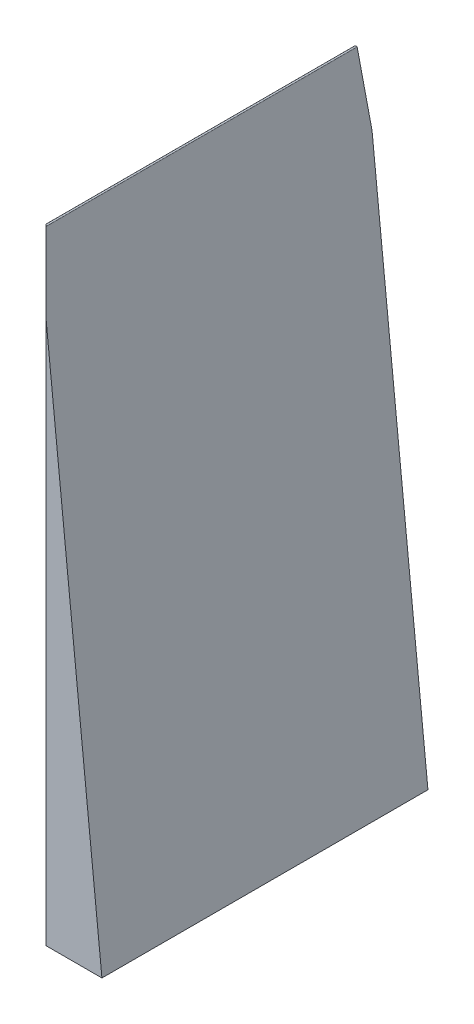
ISO-10303-21;
HEADER;
FILE_DESCRIPTION(('STEP AP214'),'2;1');
FILE_NAME('part.step','',(''),(''),'','','');
FILE_SCHEMA(('AUTOMOTIVE_DESIGN { 1 0 10303 214 1 1 1 1 }'));
ENDSEC;
DATA;
#1=APPLICATION_CONTEXT('core data for automotive mechanical design processes');
#2=APPLICATION_PROTOCOL_DEFINITION('international standard','automotive_design',2000,#1);
#3=PRODUCT_CONTEXT('',#1,'mechanical');
#4=PRODUCT('Part','Part','',(#3));
#5=PRODUCT_RELATED_PRODUCT_CATEGORY('part','',(#4));
#6=PRODUCT_DEFINITION_FORMATION('','',#4);
#7=PRODUCT_DEFINITION_CONTEXT('part definition',#1,'design');
#8=PRODUCT_DEFINITION('design','',#6,#7);
#9=PRODUCT_DEFINITION_SHAPE('','',#8);
#10=(LENGTH_UNIT() NAMED_UNIT(*) SI_UNIT(.MILLI.,.METRE.));
#11=(NAMED_UNIT(*) PLANE_ANGLE_UNIT() SI_UNIT($,.RADIAN.));
#12=(NAMED_UNIT(*) SI_UNIT($,.STERADIAN.) SOLID_ANGLE_UNIT());
#13=UNCERTAINTY_MEASURE_WITH_UNIT(LENGTH_MEASURE(1.E-05),#10,'distance_accuracy_value','');
#14=(GEOMETRIC_REPRESENTATION_CONTEXT(3) GLOBAL_UNCERTAINTY_ASSIGNED_CONTEXT((#13)) GLOBAL_UNIT_ASSIGNED_CONTEXT((#10,
#11,#12)) REPRESENTATION_CONTEXT('',''));
#15=CARTESIAN_POINT('',(0.,0.,0.));
#16=DIRECTION('',(0.,0.,1.));
#17=DIRECTION('',(1.,0.,0.));
#18=AXIS2_PLACEMENT_3D('',#15,#16,#17);
#19=CARTESIAN_POINT('',(8.89,0.,44.45));
#20=DIRECTION('',(0.,1.,0.));
#21=DIRECTION('',(0.,0.,1.));
#22=AXIS2_PLACEMENT_3D('',#19,#20,#21);
#23=PLANE('',#22);
#24=DIRECTION('',(1.,0.,0.));
#25=VECTOR('',#24,1.);
#26=CARTESIAN_POINT('',(8.89,0.,44.45));
#27=LINE('',#26,#25);
#28=CARTESIAN_POINT('',(1.26999999999999,0.,44.45));
#29=VERTEX_POINT('',#28);
#30=CARTESIAN_POINT('',(8.89,0.,44.45));
#31=VERTEX_POINT('',#30);
#32=EDGE_CURVE('E98',#29,#31,#27,.T.);
#33=ORIENTED_EDGE('',*,*,#32,.F.);
#34=DIRECTION('',(0.,0.,-1.));
#35=VECTOR('',#34,1.);
#36=CARTESIAN_POINT('',(1.26999999999999,0.,44.45));
#37=LINE('',#36,#35);
#38=CARTESIAN_POINT('',(1.26999999999999,0.,0.));
#39=VERTEX_POINT('',#38);
#40=EDGE_CURVE('E55',#29,#39,#37,.T.);
#41=ORIENTED_EDGE('',*,*,#40,.T.);
#42=DIRECTION('',(1.,0.,0.));
#43=VECTOR('',#42,1.);
#44=CARTESIAN_POINT('',(8.89,0.,0.));
#45=LINE('',#44,#43);
#46=CARTESIAN_POINT('',(8.89,0.,0.));
#47=VERTEX_POINT('',#46);
#48=EDGE_CURVE('E114',#39,#47,#45,.T.);
#49=ORIENTED_EDGE('',*,*,#48,.T.);
#50=DIRECTION('',(0.,0.,-1.));
#51=VECTOR('',#50,1.);
#52=CARTESIAN_POINT('',(8.89,0.,44.45));
#53=LINE('',#52,#51);
#54=EDGE_CURVE('E110',#31,#47,#53,.T.);
#55=ORIENTED_EDGE('',*,*,#54,.F.);
#56=EDGE_LOOP('',(#33,#41,#49,#55));
#57=FACE_BOUND('',#56,.T.);
#58=ADVANCED_FACE('F44',(#57),#23,.F.);
#59=CARTESIAN_POINT('',(0.,86.36,44.45));
#60=DIRECTION('',(-0.994743298890183,-0.102400045473989,0.));
#61=DIRECTION('',(0.102400045473989,-0.994743298890184,0.));
#62=AXIS2_PLACEMENT_3D('',#59,#60,#61);
#63=PLANE('',#62);
#64=DIRECTION('',(-0.102400045473989,0.994743298890183,0.));
#65=VECTOR('',#64,1.);
#66=CARTESIAN_POINT('',(0.,86.36,0.));
#67=LINE('',#66,#65);
#68=CARTESIAN_POINT('',(1.26999999999999,74.0228571428572,0.));
#69=VERTEX_POINT('',#68);
#70=EDGE_CURVE('E105',#47,#69,#67,.T.);
#71=ORIENTED_EDGE('',*,*,#70,.T.);
#72=DIRECTION('',(-0.101867359422504,0.989568634390042,0.101867359422504));
#73=VECTOR('',#72,1.);
#74=CARTESIAN_POINT('',(8.70549767047861,1.79230834392207,-7.43549767047862));
#75=LINE('',#74,#73);
#76=CARTESIAN_POINT('',(0.253332398959054,83.8990566958263,1.01666760104094));
#77=VERTEX_POINT('',#76);
#78=EDGE_CURVE('E143',#69,#77,#75,.T.);
#79=ORIENTED_EDGE('',*,*,#78,.T.);
#80=DIRECTION('',(0.,0.,-1.));
#81=VECTOR('',#80,1.);
#82=CARTESIAN_POINT('',(0.253332398959054,83.8990566958263,44.45));
#83=LINE('',#82,#81);
#84=CARTESIAN_POINT('',(0.253332398959054,83.8990566958263,43.4333323989591));
#85=VERTEX_POINT('',#84);
#86=EDGE_CURVE('E121',#77,#85,#83,.F.);
#87=ORIENTED_EDGE('',*,*,#86,.T.);
#88=DIRECTION('',(-0.101867359422504,0.989568634390042,-0.101867359422504));
#89=VECTOR('',#88,1.);
#90=CARTESIAN_POINT('',(8.73185514612452,1.53626429479034,51.9118551461245));
#91=LINE('',#90,#89);
#92=CARTESIAN_POINT('',(1.26999999999999,74.0228571428572,44.45));
#93=VERTEX_POINT('',#92);
#94=EDGE_CURVE('E69',#85,#93,#91,.F.);
#95=ORIENTED_EDGE('',*,*,#94,.T.);
#96=DIRECTION('',(-0.102400045473989,0.994743298890183,0.));
#97=VECTOR('',#96,1.);
#98=CARTESIAN_POINT('',(0.,86.36,44.45));
#99=LINE('',#98,#97);
#100=EDGE_CURVE('E100',#31,#93,#99,.T.);
#101=ORIENTED_EDGE('',*,*,#100,.F.);
#102=ORIENTED_EDGE('',*,*,#54,.T.);
#103=EDGE_LOOP('',(#71,#79,#87,#95,#101,#102));
#104=FACE_BOUND('',#103,.T.);
#105=ADVANCED_FACE('F109',(#104),#63,.F.);
#106=CARTESIAN_POINT('',(0.,0.,44.45));
#107=DIRECTION('',(1.,0.,0.));
#108=DIRECTION('',(0.,0.,-1.));
#109=AXIS2_PLACEMENT_3D('',#106,#107,#108);
#110=PLANE('',#109);
#111=DIRECTION('',(0.,0.,-1.));
#112=VECTOR('',#111,1.);
#113=CARTESIAN_POINT('',(0.,83.8860518900511,44.45));
#114=LINE('',#113,#112);
#115=CARTESIAN_POINT('',(0.,83.8860518900511,43.18));
#116=VERTEX_POINT('',#115);
#117=CARTESIAN_POINT('',(0.,83.8860518900511,1.26999999999999));
#118=VERTEX_POINT('',#117);
#119=EDGE_CURVE('E117',#116,#118,#114,.T.);
#120=ORIENTED_EDGE('',*,*,#119,.T.);
#121=DIRECTION('',(0.,-1.,0.));
#122=VECTOR('',#121,1.);
#123=CARTESIAN_POINT('',(0.,0.,1.26999999999999));
#124=LINE('',#123,#122);
#125=CARTESIAN_POINT('',(0.,1.26999999999999,1.26999999999999));
#126=VERTEX_POINT('',#125);
#127=EDGE_CURVE('E134',#118,#126,#124,.T.);
#128=ORIENTED_EDGE('',*,*,#127,.T.);
#129=DIRECTION('',(0.,0.,1.));
#130=VECTOR('',#129,1.);
#131=CARTESIAN_POINT('',(0.,1.26999999999999,44.45));
#132=LINE('',#131,#130);
#133=CARTESIAN_POINT('',(0.,1.26999999999999,43.18));
#134=VERTEX_POINT('',#133);
#135=EDGE_CURVE('E131',#126,#134,#132,.T.);
#136=ORIENTED_EDGE('',*,*,#135,.T.);
#137=DIRECTION('',(0.,1.,0.));
#138=VECTOR('',#137,1.);
#139=CARTESIAN_POINT('',(0.,0.,43.18));
#140=LINE('',#139,#138);
#141=EDGE_CURVE('E128',#134,#116,#140,.T.);
#142=ORIENTED_EDGE('',*,*,#141,.T.);
#143=EDGE_LOOP('',(#120,#128,#136,#142));
#144=FACE_BOUND('',#143,.T.);
#145=ADVANCED_FACE('F176',(#144),#110,.F.);
#146=CARTESIAN_POINT('',(0.,0.,44.45));
#147=DIRECTION('',(0.,0.,-1.));
#148=DIRECTION('',(-1.,0.,0.));
#149=AXIS2_PLACEMENT_3D('',#146,#147,#148);
#150=PLANE('',#149);
#151=ORIENTED_EDGE('',*,*,#100,.T.);
#152=DIRECTION('',(0.,-1.,0.));
#153=VECTOR('',#152,1.);
#154=CARTESIAN_POINT('',(1.26999999999999,0.,44.45));
#155=LINE('',#154,#153);
#156=EDGE_CURVE('E11',#93,#29,#155,.T.);
#157=ORIENTED_EDGE('',*,*,#156,.T.);
#158=ORIENTED_EDGE('',*,*,#32,.T.);
#159=EDGE_LOOP('',(#151,#157,#158));
#160=FACE_BOUND('',#159,.T.);
#161=ADVANCED_FACE('F99',(#160),#150,.F.);
#162=CARTESIAN_POINT('',(0.,0.,0.));
#163=DIRECTION('',(0.,0.,-1.));
#164=DIRECTION('',(-1.,0.,0.));
#165=AXIS2_PLACEMENT_3D('',#162,#163,#164);
#166=PLANE('',#165);
#167=ORIENTED_EDGE('',*,*,#48,.F.);
#168=DIRECTION('',(0.,1.,0.));
#169=VECTOR('',#168,1.);
#170=CARTESIAN_POINT('',(1.26999999999999,83.8860518900511,0.));
#171=LINE('',#170,#169);
#172=EDGE_CURVE('E138',#39,#69,#171,.T.);
#173=ORIENTED_EDGE('',*,*,#172,.T.);
#174=ORIENTED_EDGE('',*,*,#70,.F.);
#175=EDGE_LOOP('',(#167,#173,#174));
#176=FACE_BOUND('',#175,.T.);
#177=ADVANCED_FACE('F180',(#176),#166,.T.);
#178=CARTESIAN_POINT('',(0.127,83.8860518900511,44.45));
#179=DIRECTION('',(0.,0.,-1.));
#180=DIRECTION('',(-1.,0.,0.));
#181=AXIS2_PLACEMENT_3D('',#178,#179,#180);
#182=CYLINDRICAL_SURFACE('',#181,0.127);
#183=ORIENTED_EDGE('',*,*,#86,.F.);
#184=CARTESIAN_POINT('',(0.127,83.8860518900511,1.14299999999999));
#185=DIRECTION('',(-0.707106781186548,0.,-0.707106781186548));
#186=DIRECTION('',(0.707106781186548,0.,-0.707106781186548));
#187=AXIS2_PLACEMENT_3D('',#184,#185,#186);
#188=ELLIPSE('',#187,0.179605122421383,0.127);
#189=EDGE_CURVE('E149',#77,#118,#188,.F.);
#190=ORIENTED_EDGE('',*,*,#189,.T.);
#191=ORIENTED_EDGE('',*,*,#119,.F.);
#192=CARTESIAN_POINT('',(0.127,83.8860518900511,43.307));
#193=DIRECTION('',(0.707106781186548,0.,-0.707106781186548));
#194=DIRECTION('',(-0.707106781186548,0.,-0.707106781186548));
#195=AXIS2_PLACEMENT_3D('',#192,#193,#194);
#196=ELLIPSE('',#195,0.179605122421383,0.127);
#197=EDGE_CURVE('E146',#116,#85,#196,.T.);
#198=ORIENTED_EDGE('',*,*,#197,.T.);
#199=EDGE_LOOP('',(#183,#190,#191,#198));
#200=FACE_BOUND('',#199,.T.);
#201=ADVANCED_FACE('F173',(#200),#182,.T.);
#202=CARTESIAN_POINT('',(1.26999999999999,0.,44.45));
#203=DIRECTION('',(0.707106781186548,0.,-0.707106781186548));
#204=DIRECTION('',(0.,-1.,0.));
#205=AXIS2_PLACEMENT_3D('',#202,#203,#204);
#206=PLANE('',#205);
#207=ORIENTED_EDGE('',*,*,#197,.F.);
#208=ORIENTED_EDGE('',*,*,#141,.F.);
#209=DIRECTION('',(0.577350269189626,-0.577350269189626,0.577350269189626));
#210=VECTOR('',#209,1.);
#211=CARTESIAN_POINT('',(1.26999999999999,0.,44.45));
#212=LINE('',#211,#210);
#213=EDGE_CURVE('E49',#29,#134,#212,.F.);
#214=ORIENTED_EDGE('',*,*,#213,.F.);
#215=ORIENTED_EDGE('',*,*,#156,.F.);
#216=ORIENTED_EDGE('',*,*,#94,.F.);
#217=EDGE_LOOP('',(#207,#208,#214,#215,#216));
#218=FACE_BOUND('',#217,.T.);
#219=ADVANCED_FACE('F47',(#218),#206,.F.);
#220=CARTESIAN_POINT('',(1.26999999999999,0.,44.45));
#221=DIRECTION('',(0.707106781186548,0.707106781186548,0.));
#222=DIRECTION('',(0.,0.,-1.));
#223=AXIS2_PLACEMENT_3D('',#220,#221,#222);
#224=PLANE('',#223);
#225=ORIENTED_EDGE('',*,*,#213,.T.);
#226=ORIENTED_EDGE('',*,*,#135,.F.);
#227=DIRECTION('',(-0.577350269189626,0.577350269189626,0.577350269189626));
#228=VECTOR('',#227,1.);
#229=CARTESIAN_POINT('',(-13.5466666666667,14.8166666666667,14.8166666666667));
#230=LINE('',#229,#228);
#231=EDGE_CURVE('E153',#39,#126,#230,.T.);
#232=ORIENTED_EDGE('',*,*,#231,.F.);
#233=ORIENTED_EDGE('',*,*,#40,.F.);
#234=EDGE_LOOP('',(#225,#226,#232,#233));
#235=FACE_BOUND('',#234,.T.);
#236=ADVANCED_FACE('F179',(#235),#224,.F.);
#237=CARTESIAN_POINT('',(0.,0.,1.26999999999999));
#238=DIRECTION('',(-0.707106781186548,0.,-0.707106781186548));
#239=DIRECTION('',(0.,1.,0.));
#240=AXIS2_PLACEMENT_3D('',#237,#238,#239);
#241=PLANE('',#240);
#242=ORIENTED_EDGE('',*,*,#78,.F.);
#243=ORIENTED_EDGE('',*,*,#172,.F.);
#244=ORIENTED_EDGE('',*,*,#231,.T.);
#245=ORIENTED_EDGE('',*,*,#127,.F.);
#246=ORIENTED_EDGE('',*,*,#189,.F.);
#247=EDGE_LOOP('',(#242,#243,#244,#245,#246));
#248=FACE_BOUND('',#247,.T.);
#249=ADVANCED_FACE('F170',(#248),#241,.T.);
#250=CLOSED_SHELL('',(#58,#105,#145,#161,#177,#201,#219,#236,#249));
#251=MANIFOLD_SOLID_BREP('B2',#250);
#252=ADVANCED_BREP_SHAPE_REPRESENTATION('',(#18,#251),#14);
#253=SHAPE_DEFINITION_REPRESENTATION(#9,#252);
ENDSEC;
END-ISO-10303-21;
